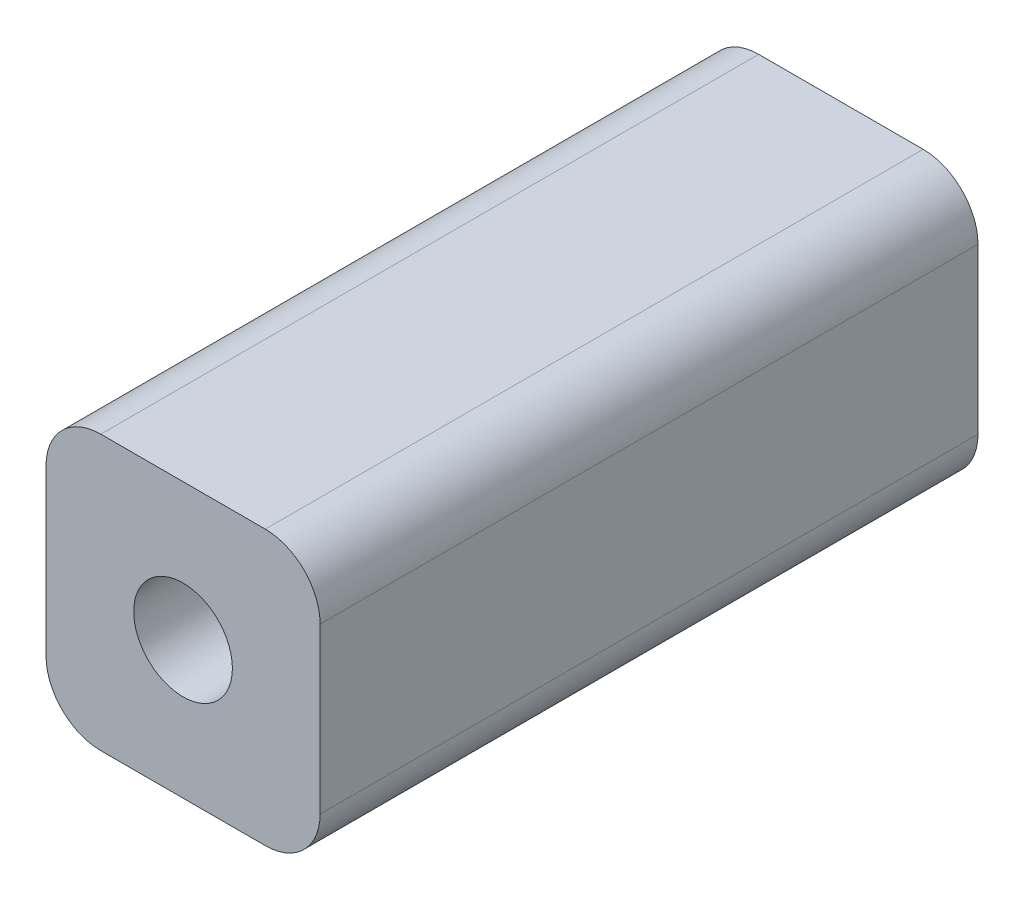
ISO-10303-21;
HEADER;
FILE_DESCRIPTION(('STEP AP214'),'2;1');
FILE_NAME('part.step','',(''),(''),'','','');
FILE_SCHEMA(('AUTOMOTIVE_DESIGN { 1 0 10303 214 1 1 1 1 }'));
ENDSEC;
DATA;
#1=APPLICATION_CONTEXT('core data for automotive mechanical design processes');
#2=APPLICATION_PROTOCOL_DEFINITION('international standard','automotive_design',2000,#1);
#3=PRODUCT_CONTEXT('',#1,'mechanical');
#4=PRODUCT('Part','Part','',(#3));
#5=PRODUCT_RELATED_PRODUCT_CATEGORY('part','',(#4));
#6=PRODUCT_DEFINITION_FORMATION('','',#4);
#7=PRODUCT_DEFINITION_CONTEXT('part definition',#1,'design');
#8=PRODUCT_DEFINITION('design','',#6,#7);
#9=PRODUCT_DEFINITION_SHAPE('','',#8);
#10=(LENGTH_UNIT() NAMED_UNIT(*) SI_UNIT(.MILLI.,.METRE.));
#11=(NAMED_UNIT(*) PLANE_ANGLE_UNIT() SI_UNIT($,.RADIAN.));
#12=(NAMED_UNIT(*) SI_UNIT($,.STERADIAN.) SOLID_ANGLE_UNIT());
#13=UNCERTAINTY_MEASURE_WITH_UNIT(LENGTH_MEASURE(1.E-05),#10,'distance_accuracy_value','');
#14=(GEOMETRIC_REPRESENTATION_CONTEXT(3) GLOBAL_UNCERTAINTY_ASSIGNED_CONTEXT((#13)) GLOBAL_UNIT_ASSIGNED_CONTEXT((#10,
#11,#12)) REPRESENTATION_CONTEXT('',''));
#15=CARTESIAN_POINT('',(0.,0.,0.));
#16=DIRECTION('',(0.,0.,1.));
#17=DIRECTION('',(1.,0.,0.));
#18=AXIS2_PLACEMENT_3D('',#15,#16,#17);
#19=CARTESIAN_POINT('',(5.,5.,24.));
#20=DIRECTION('',(-1.,0.,0.));
#21=DIRECTION('',(0.,-1.,0.));
#22=AXIS2_PLACEMENT_3D('',#19,#20,#21);
#23=PLANE('',#22);
#24=DIRECTION('',(0.,1.,0.));
#25=VECTOR('',#24,1.);
#26=CARTESIAN_POINT('',(5.,5.,24.));
#27=LINE('',#26,#25);
#28=CARTESIAN_POINT('',(5.,-3.,24.));
#29=VERTEX_POINT('',#28);
#30=CARTESIAN_POINT('',(5.,3.,24.));
#31=VERTEX_POINT('',#30);
#32=EDGE_CURVE('E124',#29,#31,#27,.T.);
#33=ORIENTED_EDGE('',*,*,#32,.F.);
#34=DIRECTION('',(0.,0.,-1.));
#35=VECTOR('',#34,1.);
#36=CARTESIAN_POINT('',(5.,-3.,24.));
#37=LINE('',#36,#35);
#38=CARTESIAN_POINT('',(5.,-3.,0.));
#39=VERTEX_POINT('',#38);
#40=EDGE_CURVE('E109',#29,#39,#37,.T.);
#41=ORIENTED_EDGE('',*,*,#40,.T.);
#42=DIRECTION('',(0.,1.,0.));
#43=VECTOR('',#42,1.);
#44=CARTESIAN_POINT('',(5.,5.,0.));
#45=LINE('',#44,#43);
#46=CARTESIAN_POINT('',(5.,3.,0.));
#47=VERTEX_POINT('',#46);
#48=EDGE_CURVE('E121',#39,#47,#45,.T.);
#49=ORIENTED_EDGE('',*,*,#48,.T.);
#50=DIRECTION('',(0.,0.,-1.));
#51=VECTOR('',#50,1.);
#52=CARTESIAN_POINT('',(5.,3.,24.));
#53=LINE('',#52,#51);
#54=EDGE_CURVE('E126',#47,#31,#53,.F.);
#55=ORIENTED_EDGE('',*,*,#54,.T.);
#56=EDGE_LOOP('',(#33,#41,#49,#55));
#57=FACE_BOUND('',#56,.T.);
#58=ADVANCED_FACE('F39',(#57),#23,.F.);
#59=CARTESIAN_POINT('',(-5.,5.,24.));
#60=DIRECTION('',(0.,-1.,0.));
#61=DIRECTION('',(0.,0.,-1.));
#62=AXIS2_PLACEMENT_3D('',#59,#60,#61);
#63=PLANE('',#62);
#64=DIRECTION('',(-1.,0.,0.));
#65=VECTOR('',#64,1.);
#66=CARTESIAN_POINT('',(-5.,5.,24.));
#67=LINE('',#66,#65);
#68=CARTESIAN_POINT('',(3.,5.,24.));
#69=VERTEX_POINT('',#68);
#70=CARTESIAN_POINT('',(-3.,5.,24.));
#71=VERTEX_POINT('',#70);
#72=EDGE_CURVE('E170',#69,#71,#67,.T.);
#73=ORIENTED_EDGE('',*,*,#72,.F.);
#74=DIRECTION('',(0.,0.,-1.));
#75=VECTOR('',#74,1.);
#76=CARTESIAN_POINT('',(3.,5.,24.));
#77=LINE('',#76,#75);
#78=CARTESIAN_POINT('',(3.,5.,0.));
#79=VERTEX_POINT('',#78);
#80=EDGE_CURVE('E163',#69,#79,#77,.T.);
#81=ORIENTED_EDGE('',*,*,#80,.T.);
#82=DIRECTION('',(-1.,0.,0.));
#83=VECTOR('',#82,1.);
#84=CARTESIAN_POINT('',(-5.,5.,0.));
#85=LINE('',#84,#83);
#86=CARTESIAN_POINT('',(-3.,5.,0.));
#87=VERTEX_POINT('',#86);
#88=EDGE_CURVE('E130',#79,#87,#85,.T.);
#89=ORIENTED_EDGE('',*,*,#88,.T.);
#90=DIRECTION('',(0.,0.,-1.));
#91=VECTOR('',#90,1.);
#92=CARTESIAN_POINT('',(-3.,5.,24.));
#93=LINE('',#92,#91);
#94=EDGE_CURVE('E161',#87,#71,#93,.F.);
#95=ORIENTED_EDGE('',*,*,#94,.T.);
#96=EDGE_LOOP('',(#73,#81,#89,#95));
#97=FACE_BOUND('',#96,.T.);
#98=ADVANCED_FACE('F168',(#97),#63,.F.);
#99=CARTESIAN_POINT('',(-5.,5.,24.));
#100=DIRECTION('',(1.,0.,0.));
#101=DIRECTION('',(0.,1.,0.));
#102=AXIS2_PLACEMENT_3D('',#99,#100,#101);
#103=PLANE('',#102);
#104=DIRECTION('',(0.,-1.,0.));
#105=VECTOR('',#104,1.);
#106=CARTESIAN_POINT('',(-5.,5.,24.));
#107=LINE('',#106,#105);
#108=CARTESIAN_POINT('',(-5.,3.,24.));
#109=VERTEX_POINT('',#108);
#110=CARTESIAN_POINT('',(-5.,-3.,24.));
#111=VERTEX_POINT('',#110);
#112=EDGE_CURVE('E178',#109,#111,#107,.T.);
#113=ORIENTED_EDGE('',*,*,#112,.F.);
#114=DIRECTION('',(0.,0.,-1.));
#115=VECTOR('',#114,1.);
#116=CARTESIAN_POINT('',(-5.,3.,24.));
#117=LINE('',#116,#115);
#118=CARTESIAN_POINT('',(-5.,3.,0.));
#119=VERTEX_POINT('',#118);
#120=EDGE_CURVE('E11',#109,#119,#117,.T.);
#121=ORIENTED_EDGE('',*,*,#120,.T.);
#122=DIRECTION('',(0.,-1.,0.));
#123=VECTOR('',#122,1.);
#124=CARTESIAN_POINT('',(-5.,5.,0.));
#125=LINE('',#124,#123);
#126=CARTESIAN_POINT('',(-5.,-3.,0.));
#127=VERTEX_POINT('',#126);
#128=EDGE_CURVE('E134',#119,#127,#125,.T.);
#129=ORIENTED_EDGE('',*,*,#128,.T.);
#130=DIRECTION('',(0.,0.,-1.));
#131=VECTOR('',#130,1.);
#132=CARTESIAN_POINT('',(-5.,-3.,24.));
#133=LINE('',#132,#131);
#134=EDGE_CURVE('E47',#127,#111,#133,.F.);
#135=ORIENTED_EDGE('',*,*,#134,.T.);
#136=EDGE_LOOP('',(#113,#121,#129,#135));
#137=FACE_BOUND('',#136,.T.);
#138=ADVANCED_FACE('F177',(#137),#103,.F.);
#139=CARTESIAN_POINT('',(-5.,-5.,24.));
#140=DIRECTION('',(0.,1.,0.));
#141=DIRECTION('',(0.,0.,1.));
#142=AXIS2_PLACEMENT_3D('',#139,#140,#141);
#143=PLANE('',#142);
#144=DIRECTION('',(1.,0.,0.));
#145=VECTOR('',#144,1.);
#146=CARTESIAN_POINT('',(-5.,-5.,0.));
#147=LINE('',#146,#145);
#148=CARTESIAN_POINT('',(-3.,-5.,0.));
#149=VERTEX_POINT('',#148);
#150=CARTESIAN_POINT('',(3.,-5.,0.));
#151=VERTEX_POINT('',#150);
#152=EDGE_CURVE('E144',#149,#151,#147,.T.);
#153=ORIENTED_EDGE('',*,*,#152,.T.);
#154=DIRECTION('',(0.,0.,-1.));
#155=VECTOR('',#154,1.);
#156=CARTESIAN_POINT('',(3.,-5.,24.));
#157=LINE('',#156,#155);
#158=CARTESIAN_POINT('',(3.,-5.,24.));
#159=VERTEX_POINT('',#158);
#160=EDGE_CURVE('E110',#151,#159,#157,.F.);
#161=ORIENTED_EDGE('',*,*,#160,.T.);
#162=DIRECTION('',(1.,0.,0.));
#163=VECTOR('',#162,1.);
#164=CARTESIAN_POINT('',(-5.,-5.,24.));
#165=LINE('',#164,#163);
#166=CARTESIAN_POINT('',(-3.,-5.,24.));
#167=VERTEX_POINT('',#166);
#168=EDGE_CURVE('E140',#167,#159,#165,.T.);
#169=ORIENTED_EDGE('',*,*,#168,.F.);
#170=DIRECTION('',(0.,0.,-1.));
#171=VECTOR('',#170,1.);
#172=CARTESIAN_POINT('',(-3.,-5.,24.));
#173=LINE('',#172,#171);
#174=EDGE_CURVE('E115',#167,#149,#173,.T.);
#175=ORIENTED_EDGE('',*,*,#174,.T.);
#176=EDGE_LOOP('',(#153,#161,#169,#175));
#177=FACE_BOUND('',#176,.T.);
#178=ADVANCED_FACE('F191',(#177),#143,.F.);
#179=CARTESIAN_POINT('',(0.,0.,24.));
#180=DIRECTION('',(0.,0.,1.));
#181=DIRECTION('',(1.,0.,0.));
#182=AXIS2_PLACEMENT_3D('',#179,#180,#181);
#183=PLANE('',#182);
#184=CARTESIAN_POINT('',(0.,0.,24.));
#185=DIRECTION('',(0.,0.,1.));
#186=DIRECTION('',(1.,0.,0.));
#187=AXIS2_PLACEMENT_3D('',#184,#185,#186);
#188=CIRCLE('',#187,1.79999999999999);
#189=CARTESIAN_POINT('',(1.79999999999999,0.,24.));
#190=VERTEX_POINT('',#189);
#191=EDGE_CURVE('E137',#190,#190,#188,.T.);
#192=ORIENTED_EDGE('',*,*,#191,.F.);
#193=EDGE_LOOP('',(#192));
#194=FACE_BOUND('',#193,.T.);
#195=ORIENTED_EDGE('',*,*,#168,.T.);
#196=CARTESIAN_POINT('',(3.,-3.,24.));
#197=DIRECTION('',(0.,0.,1.));
#198=DIRECTION('',(1.,0.,0.));
#199=AXIS2_PLACEMENT_3D('',#196,#197,#198);
#200=CIRCLE('',#199,2.);
#201=EDGE_CURVE('E159',#159,#29,#200,.T.);
#202=ORIENTED_EDGE('',*,*,#201,.T.);
#203=ORIENTED_EDGE('',*,*,#32,.T.);
#204=CARTESIAN_POINT('',(3.,3.,24.));
#205=DIRECTION('',(0.,0.,1.));
#206=DIRECTION('',(1.,0.,0.));
#207=AXIS2_PLACEMENT_3D('',#204,#205,#206);
#208=CIRCLE('',#207,2.);
#209=EDGE_CURVE('E157',#31,#69,#208,.T.);
#210=ORIENTED_EDGE('',*,*,#209,.T.);
#211=ORIENTED_EDGE('',*,*,#72,.T.);
#212=CARTESIAN_POINT('',(-3.,3.,24.));
#213=DIRECTION('',(0.,0.,1.));
#214=DIRECTION('',(1.,0.,0.));
#215=AXIS2_PLACEMENT_3D('',#212,#213,#214);
#216=CIRCLE('',#215,2.);
#217=EDGE_CURVE('E60',#71,#109,#216,.T.);
#218=ORIENTED_EDGE('',*,*,#217,.T.);
#219=ORIENTED_EDGE('',*,*,#112,.T.);
#220=CARTESIAN_POINT('',(-3.,-3.,24.));
#221=DIRECTION('',(0.,0.,1.));
#222=DIRECTION('',(1.,0.,0.));
#223=AXIS2_PLACEMENT_3D('',#220,#221,#222);
#224=CIRCLE('',#223,2.);
#225=EDGE_CURVE('E154',#111,#167,#224,.T.);
#226=ORIENTED_EDGE('',*,*,#225,.T.);
#227=EDGE_LOOP('',(#195,#202,#203,#210,#211,#218,#219,#226));
#228=FACE_BOUND('',#227,.T.);
#229=ADVANCED_FACE('F189',(#194,#228),#183,.T.);
#230=CARTESIAN_POINT('',(0.,0.,0.));
#231=DIRECTION('',(0.,0.,1.));
#232=DIRECTION('',(1.,0.,0.));
#233=AXIS2_PLACEMENT_3D('',#230,#231,#232);
#234=PLANE('',#233);
#235=CARTESIAN_POINT('',(0.,0.,0.));
#236=DIRECTION('',(0.,0.,1.));
#237=DIRECTION('',(1.,0.,0.));
#238=AXIS2_PLACEMENT_3D('',#235,#236,#237);
#239=CIRCLE('',#238,1.8);
#240=CARTESIAN_POINT('',(1.8,0.,0.));
#241=VERTEX_POINT('',#240);
#242=EDGE_CURVE('E131',#241,#241,#239,.T.);
#243=ORIENTED_EDGE('',*,*,#242,.T.);
#244=EDGE_LOOP('',(#243));
#245=FACE_BOUND('',#244,.T.);
#246=ORIENTED_EDGE('',*,*,#48,.F.);
#247=CARTESIAN_POINT('',(3.,-3.,0.));
#248=DIRECTION('',(0.,0.,1.));
#249=DIRECTION('',(1.,0.,0.));
#250=AXIS2_PLACEMENT_3D('',#247,#248,#249);
#251=CIRCLE('',#250,2.);
#252=EDGE_CURVE('E105',#39,#151,#251,.F.);
#253=ORIENTED_EDGE('',*,*,#252,.T.);
#254=ORIENTED_EDGE('',*,*,#152,.F.);
#255=CARTESIAN_POINT('',(-3.,-3.,0.));
#256=DIRECTION('',(0.,0.,1.));
#257=DIRECTION('',(1.,0.,0.));
#258=AXIS2_PLACEMENT_3D('',#255,#256,#257);
#259=CIRCLE('',#258,2.);
#260=EDGE_CURVE('E125',#149,#127,#259,.F.);
#261=ORIENTED_EDGE('',*,*,#260,.T.);
#262=ORIENTED_EDGE('',*,*,#128,.F.);
#263=CARTESIAN_POINT('',(-3.,3.,0.));
#264=DIRECTION('',(0.,0.,1.));
#265=DIRECTION('',(1.,0.,0.));
#266=AXIS2_PLACEMENT_3D('',#263,#264,#265);
#267=CIRCLE('',#266,2.);
#268=EDGE_CURVE('E148',#119,#87,#267,.F.);
#269=ORIENTED_EDGE('',*,*,#268,.T.);
#270=ORIENTED_EDGE('',*,*,#88,.F.);
#271=CARTESIAN_POINT('',(3.,3.,0.));
#272=DIRECTION('',(0.,0.,1.));
#273=DIRECTION('',(1.,0.,0.));
#274=AXIS2_PLACEMENT_3D('',#271,#272,#273);
#275=CIRCLE('',#274,2.);
#276=EDGE_CURVE('E116',#79,#47,#275,.F.);
#277=ORIENTED_EDGE('',*,*,#276,.T.);
#278=EDGE_LOOP('',(#246,#253,#254,#261,#262,#269,#270,#277));
#279=FACE_BOUND('',#278,.T.);
#280=ADVANCED_FACE('F128',(#245,#279),#234,.F.);
#281=CARTESIAN_POINT('',(0.,0.,24.));
#282=DIRECTION('',(0.,0.,1.));
#283=DIRECTION('',(1.,0.,0.));
#284=AXIS2_PLACEMENT_3D('',#281,#282,#283);
#285=CYLINDRICAL_SURFACE('',#284,1.79999999999999);
#286=ORIENTED_EDGE('',*,*,#242,.F.);
#287=EDGE_LOOP('',(#286));
#288=FACE_BOUND('',#287,.T.);
#289=ORIENTED_EDGE('',*,*,#191,.T.);
#290=EDGE_LOOP('',(#289));
#291=FACE_BOUND('',#290,.T.);
#292=ADVANCED_FACE('F187',(#288,#291),#285,.F.);
#293=CARTESIAN_POINT('',(3.,-3.,24.));
#294=DIRECTION('',(0.,0.,-1.));
#295=DIRECTION('',(-1.,0.,0.));
#296=AXIS2_PLACEMENT_3D('',#293,#294,#295);
#297=CYLINDRICAL_SURFACE('',#296,2.);
#298=ORIENTED_EDGE('',*,*,#201,.F.);
#299=ORIENTED_EDGE('',*,*,#160,.F.);
#300=ORIENTED_EDGE('',*,*,#252,.F.);
#301=ORIENTED_EDGE('',*,*,#40,.F.);
#302=EDGE_LOOP('',(#298,#299,#300,#301));
#303=FACE_BOUND('',#302,.T.);
#304=ADVANCED_FACE('F108',(#303),#297,.T.);
#305=CARTESIAN_POINT('',(3.,3.,24.));
#306=DIRECTION('',(0.,0.,-1.));
#307=DIRECTION('',(-1.,0.,0.));
#308=AXIS2_PLACEMENT_3D('',#305,#306,#307);
#309=CYLINDRICAL_SURFACE('',#308,2.);
#310=ORIENTED_EDGE('',*,*,#209,.F.);
#311=ORIENTED_EDGE('',*,*,#54,.F.);
#312=ORIENTED_EDGE('',*,*,#276,.F.);
#313=ORIENTED_EDGE('',*,*,#80,.F.);
#314=EDGE_LOOP('',(#310,#311,#312,#313));
#315=FACE_BOUND('',#314,.T.);
#316=ADVANCED_FACE('F201',(#315),#309,.T.);
#317=CARTESIAN_POINT('',(-3.,3.,24.));
#318=DIRECTION('',(0.,0.,-1.));
#319=DIRECTION('',(-1.,0.,0.));
#320=AXIS2_PLACEMENT_3D('',#317,#318,#319);
#321=CYLINDRICAL_SURFACE('',#320,2.);
#322=ORIENTED_EDGE('',*,*,#217,.F.);
#323=ORIENTED_EDGE('',*,*,#94,.F.);
#324=ORIENTED_EDGE('',*,*,#268,.F.);
#325=ORIENTED_EDGE('',*,*,#120,.F.);
#326=EDGE_LOOP('',(#322,#323,#324,#325));
#327=FACE_BOUND('',#326,.T.);
#328=ADVANCED_FACE('F176',(#327),#321,.T.);
#329=CARTESIAN_POINT('',(-3.,-3.,24.));
#330=DIRECTION('',(0.,0.,-1.));
#331=DIRECTION('',(-1.,0.,0.));
#332=AXIS2_PLACEMENT_3D('',#329,#330,#331);
#333=CYLINDRICAL_SURFACE('',#332,2.);
#334=ORIENTED_EDGE('',*,*,#225,.F.);
#335=ORIENTED_EDGE('',*,*,#134,.F.);
#336=ORIENTED_EDGE('',*,*,#260,.F.);
#337=ORIENTED_EDGE('',*,*,#174,.F.);
#338=EDGE_LOOP('',(#334,#335,#336,#337));
#339=FACE_BOUND('',#338,.T.);
#340=ADVANCED_FACE('F41',(#339),#333,.T.);
#341=CLOSED_SHELL('',(#58,#98,#138,#178,#229,#280,#292,#304,#316,#328,#340));
#342=MANIFOLD_SOLID_BREP('B2',#341);
#343=ADVANCED_BREP_SHAPE_REPRESENTATION('',(#18,#342),#14);
#344=SHAPE_DEFINITION_REPRESENTATION(#9,#343);
ENDSEC;
END-ISO-10303-21;
